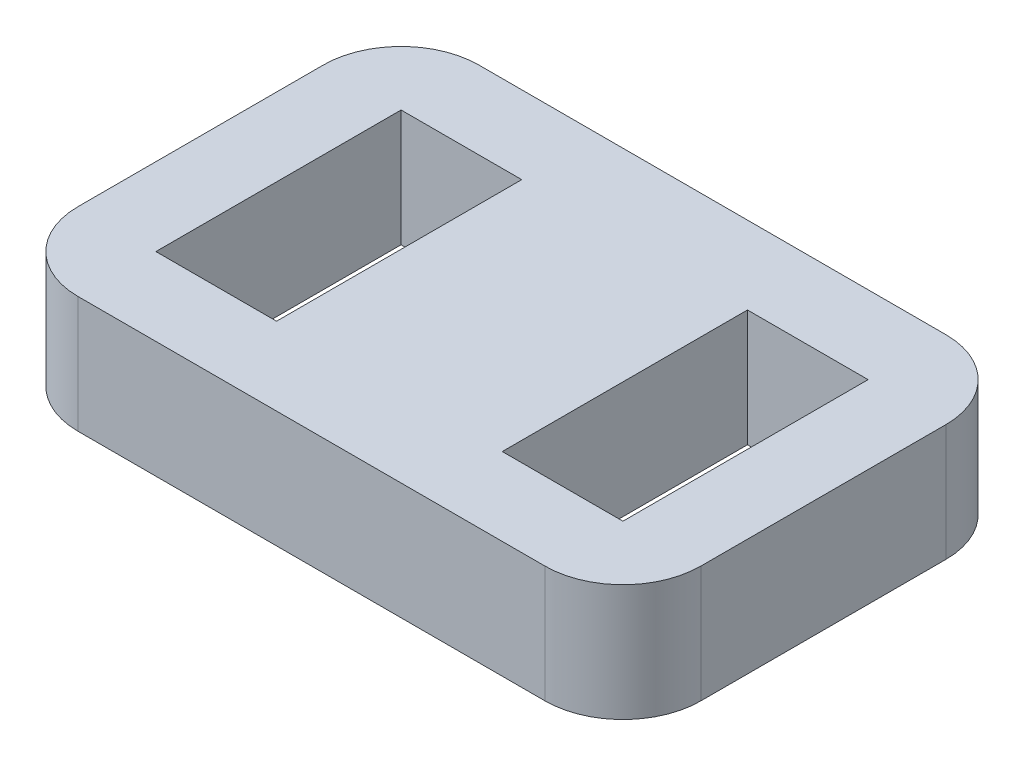
ISO-10303-21;
HEADER;
FILE_DESCRIPTION(('STEP AP214'),'2;1');
FILE_NAME('part.step','',(''),(''),'','','');
FILE_SCHEMA(('AUTOMOTIVE_DESIGN { 1 0 10303 214 1 1 1 1 }'));
ENDSEC;
DATA;
#1=APPLICATION_CONTEXT('core data for automotive mechanical design processes');
#2=APPLICATION_PROTOCOL_DEFINITION('international standard','automotive_design',2000,#1);
#3=PRODUCT_CONTEXT('',#1,'mechanical');
#4=PRODUCT('Part','Part','',(#3));
#5=PRODUCT_RELATED_PRODUCT_CATEGORY('part','',(#4));
#6=PRODUCT_DEFINITION_FORMATION('','',#4);
#7=PRODUCT_DEFINITION_CONTEXT('part definition',#1,'design');
#8=PRODUCT_DEFINITION('design','',#6,#7);
#9=PRODUCT_DEFINITION_SHAPE('','',#8);
#10=(LENGTH_UNIT() NAMED_UNIT(*) SI_UNIT(.MILLI.,.METRE.));
#11=(NAMED_UNIT(*) PLANE_ANGLE_UNIT() SI_UNIT($,.RADIAN.));
#12=(NAMED_UNIT(*) SI_UNIT($,.STERADIAN.) SOLID_ANGLE_UNIT());
#13=UNCERTAINTY_MEASURE_WITH_UNIT(LENGTH_MEASURE(1.E-05),#10,'distance_accuracy_value','');
#14=(GEOMETRIC_REPRESENTATION_CONTEXT(3) GLOBAL_UNCERTAINTY_ASSIGNED_CONTEXT((#13)) GLOBAL_UNIT_ASSIGNED_CONTEXT((#10,
#11,#12)) REPRESENTATION_CONTEXT('',''));
#15=CARTESIAN_POINT('',(0.,0.,0.));
#16=DIRECTION('',(0.,0.,1.));
#17=DIRECTION('',(1.,0.,0.));
#18=AXIS2_PLACEMENT_3D('',#15,#16,#17);
#19=CARTESIAN_POINT('',(6.,3.,3.15000000000001));
#20=DIRECTION('',(0.,1.,0.));
#21=DIRECTION('',(0.,0.,1.));
#22=AXIS2_PLACEMENT_3D('',#19,#20,#21);
#23=PLANE('',#22);
#24=DIRECTION('',(1.,0.,0.));
#25=VECTOR('',#24,1.);
#26=CARTESIAN_POINT('',(-2.9,3.,5.15));
#27=LINE('',#26,#25);
#28=CARTESIAN_POINT('',(-5.99999999999999,3.,5.15000000000001));
#29=VERTEX_POINT('',#28);
#30=CARTESIAN_POINT('',(5.99999999999999,3.,5.15000000000001));
#31=VERTEX_POINT('',#30);
#32=EDGE_CURVE('E244',#29,#31,#27,.T.);
#33=ORIENTED_EDGE('',*,*,#32,.T.);
#34=CARTESIAN_POINT('',(6.,3.,3.15000000000001));
#35=DIRECTION('',(0.,1.,0.));
#36=DIRECTION('',(0.,0.,1.));
#37=AXIS2_PLACEMENT_3D('',#34,#35,#36);
#38=CIRCLE('',#37,2.);
#39=CARTESIAN_POINT('',(8.,3.,3.14999999999999));
#40=VERTEX_POINT('',#39);
#41=EDGE_CURVE('E248',#31,#40,#38,.T.);
#42=ORIENTED_EDGE('',*,*,#41,.T.);
#43=DIRECTION('',(0.,0.,-1.));
#44=VECTOR('',#43,1.);
#45=CARTESIAN_POINT('',(8.,3.,3.14999999999999));
#46=LINE('',#45,#44);
#47=CARTESIAN_POINT('',(8.,3.,-3.14999999999999));
#48=VERTEX_POINT('',#47);
#49=EDGE_CURVE('E252',#40,#48,#46,.T.);
#50=ORIENTED_EDGE('',*,*,#49,.T.);
#51=CARTESIAN_POINT('',(6.,3.,-3.15000000000001));
#52=DIRECTION('',(0.,1.,0.));
#53=DIRECTION('',(0.,0.,-1.));
#54=AXIS2_PLACEMENT_3D('',#51,#52,#53);
#55=CIRCLE('',#54,2.);
#56=CARTESIAN_POINT('',(5.99999999999998,3.,-5.15000000000001));
#57=VERTEX_POINT('',#56);
#58=EDGE_CURVE('E255',#48,#57,#55,.T.);
#59=ORIENTED_EDGE('',*,*,#58,.T.);
#60=DIRECTION('',(-1.,0.,0.));
#61=VECTOR('',#60,1.);
#62=CARTESIAN_POINT('',(-2.9,3.,-5.15));
#63=LINE('',#62,#61);
#64=CARTESIAN_POINT('',(-5.99999999999998,3.,-5.15000000000001));
#65=VERTEX_POINT('',#64);
#66=EDGE_CURVE('E258',#57,#65,#63,.T.);
#67=ORIENTED_EDGE('',*,*,#66,.T.);
#68=CARTESIAN_POINT('',(-6.,3.,-3.15000000000001));
#69=DIRECTION('',(0.,1.,0.));
#70=DIRECTION('',(0.,0.,1.));
#71=AXIS2_PLACEMENT_3D('',#68,#69,#70);
#72=CIRCLE('',#71,2.);
#73=CARTESIAN_POINT('',(-8.,3.,-3.14999999999999));
#74=VERTEX_POINT('',#73);
#75=EDGE_CURVE('E261',#65,#74,#72,.T.);
#76=ORIENTED_EDGE('',*,*,#75,.T.);
#77=DIRECTION('',(0.,0.,1.));
#78=VECTOR('',#77,1.);
#79=CARTESIAN_POINT('',(-8.,3.,-3.14999999999999));
#80=LINE('',#79,#78);
#81=CARTESIAN_POINT('',(-8.,3.,3.14999999999999));
#82=VERTEX_POINT('',#81);
#83=EDGE_CURVE('E264',#74,#82,#80,.T.);
#84=ORIENTED_EDGE('',*,*,#83,.T.);
#85=CARTESIAN_POINT('',(-6.,3.,3.15000000000001));
#86=DIRECTION('',(0.,1.,0.));
#87=DIRECTION('',(0.,0.,1.));
#88=AXIS2_PLACEMENT_3D('',#85,#86,#87);
#89=CIRCLE('',#88,2.);
#90=EDGE_CURVE('E267',#82,#29,#89,.T.);
#91=ORIENTED_EDGE('',*,*,#90,.T.);
#92=EDGE_LOOP('',(#33,#42,#50,#59,#67,#76,#84,#91));
#93=FACE_BOUND('',#92,.T.);
#94=DIRECTION('',(-1.,0.,0.));
#95=VECTOR('',#94,1.);
#96=CARTESIAN_POINT('',(-6.,3.,-3.15));
#97=LINE('',#96,#95);
#98=CARTESIAN_POINT('',(-2.9,3.,-3.15));
#99=VERTEX_POINT('',#98);
#100=CARTESIAN_POINT('',(-6.,3.,-3.15));
#101=VERTEX_POINT('',#100);
#102=EDGE_CURVE('E204',#99,#101,#97,.T.);
#103=ORIENTED_EDGE('',*,*,#102,.F.);
#104=DIRECTION('',(0.,0.,-1.));
#105=VECTOR('',#104,1.);
#106=CARTESIAN_POINT('',(-2.9,3.,-3.15));
#107=LINE('',#106,#105);
#108=CARTESIAN_POINT('',(-2.9,3.,3.15));
#109=VERTEX_POINT('',#108);
#110=EDGE_CURVE('E201',#109,#99,#107,.T.);
#111=ORIENTED_EDGE('',*,*,#110,.F.);
#112=DIRECTION('',(1.,0.,0.));
#113=VECTOR('',#112,1.);
#114=CARTESIAN_POINT('',(-6.,3.,3.15));
#115=LINE('',#114,#113);
#116=CARTESIAN_POINT('',(-6.,3.,3.15));
#117=VERTEX_POINT('',#116);
#118=EDGE_CURVE('E212',#117,#109,#115,.T.);
#119=ORIENTED_EDGE('',*,*,#118,.F.);
#120=DIRECTION('',(0.,0.,1.));
#121=VECTOR('',#120,1.);
#122=CARTESIAN_POINT('',(-6.,3.,-3.15));
#123=LINE('',#122,#121);
#124=EDGE_CURVE('E208',#101,#117,#123,.T.);
#125=ORIENTED_EDGE('',*,*,#124,.F.);
#126=EDGE_LOOP('',(#103,#111,#119,#125));
#127=FACE_BOUND('',#126,.T.);
#128=DIRECTION('',(-1.,0.,0.));
#129=VECTOR('',#128,1.);
#130=CARTESIAN_POINT('',(6.,3.,-3.15));
#131=LINE('',#130,#129);
#132=CARTESIAN_POINT('',(6.,3.,-3.15));
#133=VERTEX_POINT('',#132);
#134=CARTESIAN_POINT('',(2.9,3.,-3.15));
#135=VERTEX_POINT('',#134);
#136=EDGE_CURVE('E162',#133,#135,#131,.T.);
#137=ORIENTED_EDGE('',*,*,#136,.F.);
#138=DIRECTION('',(0.,0.,-1.));
#139=VECTOR('',#138,1.);
#140=CARTESIAN_POINT('',(6.,3.,-3.15));
#141=LINE('',#140,#139);
#142=CARTESIAN_POINT('',(6.,3.,3.15));
#143=VERTEX_POINT('',#142);
#144=EDGE_CURVE('E153',#143,#133,#141,.T.);
#145=ORIENTED_EDGE('',*,*,#144,.F.);
#146=DIRECTION('',(1.,0.,0.));
#147=VECTOR('',#146,1.);
#148=CARTESIAN_POINT('',(6.,3.,3.15));
#149=LINE('',#148,#147);
#150=CARTESIAN_POINT('',(2.9,3.,3.15));
#151=VERTEX_POINT('',#150);
#152=EDGE_CURVE('E179',#151,#143,#149,.T.);
#153=ORIENTED_EDGE('',*,*,#152,.F.);
#154=DIRECTION('',(0.,0.,1.));
#155=VECTOR('',#154,1.);
#156=CARTESIAN_POINT('',(2.9,3.,-3.15));
#157=LINE('',#156,#155);
#158=EDGE_CURVE('E175',#135,#151,#157,.T.);
#159=ORIENTED_EDGE('',*,*,#158,.F.);
#160=EDGE_LOOP('',(#137,#145,#153,#159));
#161=FACE_BOUND('',#160,.T.);
#162=ADVANCED_FACE('F39',(#93,#127,#161),#23,.T.);
#163=CARTESIAN_POINT('',(6.,0.,3.15000000000001));
#164=DIRECTION('',(0.,1.,0.));
#165=DIRECTION('',(0.,0.,1.));
#166=AXIS2_PLACEMENT_3D('',#163,#164,#165);
#167=PLANE('',#166);
#168=DIRECTION('',(0.,0.,-1.));
#169=VECTOR('',#168,1.);
#170=CARTESIAN_POINT('',(-2.9,0.,-3.15));
#171=LINE('',#170,#169);
#172=CARTESIAN_POINT('',(-2.9,0.,3.15));
#173=VERTEX_POINT('',#172);
#174=CARTESIAN_POINT('',(-2.9,0.,-3.15));
#175=VERTEX_POINT('',#174);
#176=EDGE_CURVE('E171',#173,#175,#171,.T.);
#177=ORIENTED_EDGE('',*,*,#176,.T.);
#178=DIRECTION('',(-1.,0.,0.));
#179=VECTOR('',#178,1.);
#180=CARTESIAN_POINT('',(-6.,0.,-3.15));
#181=LINE('',#180,#179);
#182=CARTESIAN_POINT('',(-6.,0.,-3.15));
#183=VERTEX_POINT('',#182);
#184=EDGE_CURVE('E219',#175,#183,#181,.T.);
#185=ORIENTED_EDGE('',*,*,#184,.T.);
#186=DIRECTION('',(0.,0.,1.));
#187=VECTOR('',#186,1.);
#188=CARTESIAN_POINT('',(-6.,0.,-3.15));
#189=LINE('',#188,#187);
#190=CARTESIAN_POINT('',(-6.,0.,3.15));
#191=VERTEX_POINT('',#190);
#192=EDGE_CURVE('E223',#183,#191,#189,.T.);
#193=ORIENTED_EDGE('',*,*,#192,.T.);
#194=DIRECTION('',(1.,0.,0.));
#195=VECTOR('',#194,1.);
#196=CARTESIAN_POINT('',(-6.,0.,3.15));
#197=LINE('',#196,#195);
#198=EDGE_CURVE('E205',#191,#173,#197,.T.);
#199=ORIENTED_EDGE('',*,*,#198,.T.);
#200=EDGE_LOOP('',(#177,#185,#193,#199));
#201=FACE_BOUND('',#200,.T.);
#202=CARTESIAN_POINT('',(6.,0.,3.15000000000001));
#203=DIRECTION('',(0.,1.,0.));
#204=DIRECTION('',(0.,0.,1.));
#205=AXIS2_PLACEMENT_3D('',#202,#203,#204);
#206=CIRCLE('',#205,2.);
#207=CARTESIAN_POINT('',(5.99999999999999,0.,5.15000000000001));
#208=VERTEX_POINT('',#207);
#209=CARTESIAN_POINT('',(8.,0.,3.14999999999999));
#210=VERTEX_POINT('',#209);
#211=EDGE_CURVE('E243',#208,#210,#206,.T.);
#212=ORIENTED_EDGE('',*,*,#211,.F.);
#213=DIRECTION('',(1.,0.,0.));
#214=VECTOR('',#213,1.);
#215=CARTESIAN_POINT('',(-5.99999999999999,0.,5.15000000000001));
#216=LINE('',#215,#214);
#217=CARTESIAN_POINT('',(-5.99999999999999,0.,5.15000000000001));
#218=VERTEX_POINT('',#217);
#219=EDGE_CURVE('E249',#218,#208,#216,.T.);
#220=ORIENTED_EDGE('',*,*,#219,.F.);
#221=CARTESIAN_POINT('',(-6.,0.,3.15000000000001));
#222=DIRECTION('',(0.,1.,0.));
#223=DIRECTION('',(0.,0.,1.));
#224=AXIS2_PLACEMENT_3D('',#221,#222,#223);
#225=CIRCLE('',#224,2.);
#226=CARTESIAN_POINT('',(-8.,0.,3.14999999999999));
#227=VERTEX_POINT('',#226);
#228=EDGE_CURVE('E290',#227,#218,#225,.T.);
#229=ORIENTED_EDGE('',*,*,#228,.F.);
#230=DIRECTION('',(0.,0.,1.));
#231=VECTOR('',#230,1.);
#232=CARTESIAN_POINT('',(-8.,0.,-3.14999999999999));
#233=LINE('',#232,#231);
#234=CARTESIAN_POINT('',(-8.,0.,-3.14999999999999));
#235=VERTEX_POINT('',#234);
#236=EDGE_CURVE('E287',#235,#227,#233,.T.);
#237=ORIENTED_EDGE('',*,*,#236,.F.);
#238=CARTESIAN_POINT('',(-6.,0.,-3.15000000000001));
#239=DIRECTION('',(0.,1.,0.));
#240=DIRECTION('',(0.,0.,1.));
#241=AXIS2_PLACEMENT_3D('',#238,#239,#240);
#242=CIRCLE('',#241,2.);
#243=CARTESIAN_POINT('',(-5.99999999999998,0.,-5.15000000000001));
#244=VERTEX_POINT('',#243);
#245=EDGE_CURVE('E284',#244,#235,#242,.T.);
#246=ORIENTED_EDGE('',*,*,#245,.F.);
#247=DIRECTION('',(-1.,0.,0.));
#248=VECTOR('',#247,1.);
#249=CARTESIAN_POINT('',(-5.99999999999998,0.,-5.15000000000001));
#250=LINE('',#249,#248);
#251=CARTESIAN_POINT('',(5.99999999999998,0.,-5.15000000000001));
#252=VERTEX_POINT('',#251);
#253=EDGE_CURVE('E281',#252,#244,#250,.T.);
#254=ORIENTED_EDGE('',*,*,#253,.F.);
#255=CARTESIAN_POINT('',(6.,0.,-3.15000000000001));
#256=DIRECTION('',(0.,1.,0.));
#257=DIRECTION('',(0.,0.,-1.));
#258=AXIS2_PLACEMENT_3D('',#255,#256,#257);
#259=CIRCLE('',#258,2.);
#260=CARTESIAN_POINT('',(8.,0.,-3.14999999999999));
#261=VERTEX_POINT('',#260);
#262=EDGE_CURVE('E277',#261,#252,#259,.T.);
#263=ORIENTED_EDGE('',*,*,#262,.F.);
#264=DIRECTION('',(0.,0.,-1.));
#265=VECTOR('',#264,1.);
#266=CARTESIAN_POINT('',(8.,0.,3.14999999999999));
#267=LINE('',#266,#265);
#268=EDGE_CURVE('E274',#210,#261,#267,.T.);
#269=ORIENTED_EDGE('',*,*,#268,.F.);
#270=EDGE_LOOP('',(#212,#220,#229,#237,#246,#254,#263,#269));
#271=FACE_BOUND('',#270,.T.);
#272=DIRECTION('',(0.,0.,-1.));
#273=VECTOR('',#272,1.);
#274=CARTESIAN_POINT('',(6.,0.,-3.15));
#275=LINE('',#274,#273);
#276=CARTESIAN_POINT('',(6.,0.,3.15));
#277=VERTEX_POINT('',#276);
#278=CARTESIAN_POINT('',(6.,0.,-3.15));
#279=VERTEX_POINT('',#278);
#280=EDGE_CURVE('E63',#277,#279,#275,.T.);
#281=ORIENTED_EDGE('',*,*,#280,.T.);
#282=DIRECTION('',(-1.,0.,0.));
#283=VECTOR('',#282,1.);
#284=CARTESIAN_POINT('',(6.,0.,-3.15));
#285=LINE('',#284,#283);
#286=CARTESIAN_POINT('',(2.9,0.,-3.15));
#287=VERTEX_POINT('',#286);
#288=EDGE_CURVE('E169',#279,#287,#285,.T.);
#289=ORIENTED_EDGE('',*,*,#288,.T.);
#290=DIRECTION('',(0.,0.,1.));
#291=VECTOR('',#290,1.);
#292=CARTESIAN_POINT('',(2.9,0.,-3.15));
#293=LINE('',#292,#291);
#294=CARTESIAN_POINT('',(2.9,0.,3.15));
#295=VERTEX_POINT('',#294);
#296=EDGE_CURVE('E188',#287,#295,#293,.T.);
#297=ORIENTED_EDGE('',*,*,#296,.T.);
#298=DIRECTION('',(1.,0.,0.));
#299=VECTOR('',#298,1.);
#300=CARTESIAN_POINT('',(6.,0.,3.15));
#301=LINE('',#300,#299);
#302=EDGE_CURVE('E163',#295,#277,#301,.T.);
#303=ORIENTED_EDGE('',*,*,#302,.T.);
#304=EDGE_LOOP('',(#281,#289,#297,#303));
#305=FACE_BOUND('',#304,.T.);
#306=ADVANCED_FACE('F329',(#201,#271,#305),#167,.F.);
#307=CARTESIAN_POINT('',(6.,3.,3.15000000000001));
#308=DIRECTION('',(0.,-1.,0.));
#309=DIRECTION('',(0.,0.,-1.));
#310=AXIS2_PLACEMENT_3D('',#307,#308,#309);
#311=CYLINDRICAL_SURFACE('',#310,2.);
#312=ORIENTED_EDGE('',*,*,#211,.T.);
#313=DIRECTION('',(0.,-1.,0.));
#314=VECTOR('',#313,1.);
#315=CARTESIAN_POINT('',(8.,3.,3.14999999999999));
#316=LINE('',#315,#314);
#317=EDGE_CURVE('E48',#40,#210,#316,.T.);
#318=ORIENTED_EDGE('',*,*,#317,.F.);
#319=ORIENTED_EDGE('',*,*,#41,.F.);
#320=DIRECTION('',(0.,-1.,0.));
#321=VECTOR('',#320,1.);
#322=CARTESIAN_POINT('',(5.99999999999999,3.,5.15000000000001));
#323=LINE('',#322,#321);
#324=EDGE_CURVE('E11',#31,#208,#323,.T.);
#325=ORIENTED_EDGE('',*,*,#324,.T.);
#326=EDGE_LOOP('',(#312,#318,#319,#325));
#327=FACE_BOUND('',#326,.T.);
#328=ADVANCED_FACE('F41',(#327),#311,.T.);
#329=CARTESIAN_POINT('',(8.,3.,3.14999999999999));
#330=DIRECTION('',(-1.,0.,0.));
#331=DIRECTION('',(0.,0.,1.));
#332=AXIS2_PLACEMENT_3D('',#329,#330,#331);
#333=PLANE('',#332);
#334=ORIENTED_EDGE('',*,*,#268,.T.);
#335=DIRECTION('',(0.,-1.,0.));
#336=VECTOR('',#335,1.);
#337=CARTESIAN_POINT('',(8.,3.,-3.14999999999999));
#338=LINE('',#337,#336);
#339=EDGE_CURVE('E314',#48,#261,#338,.T.);
#340=ORIENTED_EDGE('',*,*,#339,.F.);
#341=ORIENTED_EDGE('',*,*,#49,.F.);
#342=ORIENTED_EDGE('',*,*,#317,.T.);
#343=EDGE_LOOP('',(#334,#340,#341,#342));
#344=FACE_BOUND('',#343,.T.);
#345=ADVANCED_FACE('F323',(#344),#333,.F.);
#346=CARTESIAN_POINT('',(6.,3.,-3.15000000000001));
#347=DIRECTION('',(0.,-1.,0.));
#348=DIRECTION('',(0.,0.,-1.));
#349=AXIS2_PLACEMENT_3D('',#346,#347,#348);
#350=CYLINDRICAL_SURFACE('',#349,2.);
#351=ORIENTED_EDGE('',*,*,#262,.T.);
#352=DIRECTION('',(0.,-1.,0.));
#353=VECTOR('',#352,1.);
#354=CARTESIAN_POINT('',(5.99999999999998,3.,-5.15000000000001));
#355=LINE('',#354,#353);
#356=EDGE_CURVE('E310',#57,#252,#355,.T.);
#357=ORIENTED_EDGE('',*,*,#356,.F.);
#358=ORIENTED_EDGE('',*,*,#58,.F.);
#359=ORIENTED_EDGE('',*,*,#339,.T.);
#360=EDGE_LOOP('',(#351,#357,#358,#359));
#361=FACE_BOUND('',#360,.T.);
#362=ADVANCED_FACE('F335',(#361),#350,.T.);
#363=CARTESIAN_POINT('',(-5.99999999999998,3.,-5.15000000000001));
#364=DIRECTION('',(0.,0.,1.));
#365=DIRECTION('',(1.,0.,0.));
#366=AXIS2_PLACEMENT_3D('',#363,#364,#365);
#367=PLANE('',#366);
#368=ORIENTED_EDGE('',*,*,#253,.T.);
#369=DIRECTION('',(0.,-1.,0.));
#370=VECTOR('',#369,1.);
#371=CARTESIAN_POINT('',(-5.99999999999998,3.,-5.15000000000001));
#372=LINE('',#371,#370);
#373=EDGE_CURVE('E306',#65,#244,#372,.T.);
#374=ORIENTED_EDGE('',*,*,#373,.F.);
#375=ORIENTED_EDGE('',*,*,#66,.F.);
#376=ORIENTED_EDGE('',*,*,#356,.T.);
#377=EDGE_LOOP('',(#368,#374,#375,#376));
#378=FACE_BOUND('',#377,.T.);
#379=ADVANCED_FACE('F339',(#378),#367,.F.);
#380=CARTESIAN_POINT('',(-6.,3.,-3.15000000000001));
#381=DIRECTION('',(0.,-1.,0.));
#382=DIRECTION('',(0.,0.,-1.));
#383=AXIS2_PLACEMENT_3D('',#380,#381,#382);
#384=CYLINDRICAL_SURFACE('',#383,2.);
#385=ORIENTED_EDGE('',*,*,#245,.T.);
#386=DIRECTION('',(0.,-1.,0.));
#387=VECTOR('',#386,1.);
#388=CARTESIAN_POINT('',(-8.,3.,-3.14999999999999));
#389=LINE('',#388,#387);
#390=EDGE_CURVE('E302',#74,#235,#389,.T.);
#391=ORIENTED_EDGE('',*,*,#390,.F.);
#392=ORIENTED_EDGE('',*,*,#75,.F.);
#393=ORIENTED_EDGE('',*,*,#373,.T.);
#394=EDGE_LOOP('',(#385,#391,#392,#393));
#395=FACE_BOUND('',#394,.T.);
#396=ADVANCED_FACE('F359',(#395),#384,.T.);
#397=CARTESIAN_POINT('',(-8.,3.,-3.14999999999999));
#398=DIRECTION('',(1.,0.,0.));
#399=DIRECTION('',(0.,0.,-1.));
#400=AXIS2_PLACEMENT_3D('',#397,#398,#399);
#401=PLANE('',#400);
#402=ORIENTED_EDGE('',*,*,#236,.T.);
#403=DIRECTION('',(0.,-1.,0.));
#404=VECTOR('',#403,1.);
#405=CARTESIAN_POINT('',(-8.,3.,3.14999999999999));
#406=LINE('',#405,#404);
#407=EDGE_CURVE('E298',#82,#227,#406,.T.);
#408=ORIENTED_EDGE('',*,*,#407,.F.);
#409=ORIENTED_EDGE('',*,*,#83,.F.);
#410=ORIENTED_EDGE('',*,*,#390,.T.);
#411=EDGE_LOOP('',(#402,#408,#409,#410));
#412=FACE_BOUND('',#411,.T.);
#413=ADVANCED_FACE('F357',(#412),#401,.F.);
#414=CARTESIAN_POINT('',(-6.,3.,3.15000000000001));
#415=DIRECTION('',(0.,-1.,0.));
#416=DIRECTION('',(0.,0.,-1.));
#417=AXIS2_PLACEMENT_3D('',#414,#415,#416);
#418=CYLINDRICAL_SURFACE('',#417,2.);
#419=ORIENTED_EDGE('',*,*,#228,.T.);
#420=DIRECTION('',(0.,-1.,0.));
#421=VECTOR('',#420,1.);
#422=CARTESIAN_POINT('',(-5.99999999999999,3.,5.15000000000001));
#423=LINE('',#422,#421);
#424=EDGE_CURVE('E271',#29,#218,#423,.T.);
#425=ORIENTED_EDGE('',*,*,#424,.F.);
#426=ORIENTED_EDGE('',*,*,#90,.F.);
#427=ORIENTED_EDGE('',*,*,#407,.T.);
#428=EDGE_LOOP('',(#419,#425,#426,#427));
#429=FACE_BOUND('',#428,.T.);
#430=ADVANCED_FACE('F352',(#429),#418,.T.);
#431=CARTESIAN_POINT('',(-5.99999999999999,3.,5.15000000000001));
#432=DIRECTION('',(0.,0.,-1.));
#433=DIRECTION('',(-1.,0.,0.));
#434=AXIS2_PLACEMENT_3D('',#431,#432,#433);
#435=PLANE('',#434);
#436=ORIENTED_EDGE('',*,*,#219,.T.);
#437=ORIENTED_EDGE('',*,*,#324,.F.);
#438=ORIENTED_EDGE('',*,*,#32,.F.);
#439=ORIENTED_EDGE('',*,*,#424,.T.);
#440=EDGE_LOOP('',(#436,#437,#438,#439));
#441=FACE_BOUND('',#440,.T.);
#442=ADVANCED_FACE('F347',(#441),#435,.F.);
#443=CARTESIAN_POINT('',(-2.9,3.,-3.15));
#444=DIRECTION('',(-1.,0.,0.));
#445=DIRECTION('',(0.,0.,1.));
#446=AXIS2_PLACEMENT_3D('',#443,#444,#445);
#447=PLANE('',#446);
#448=ORIENTED_EDGE('',*,*,#176,.F.);
#449=DIRECTION('',(0.,-1.,0.));
#450=VECTOR('',#449,1.);
#451=CARTESIAN_POINT('',(-2.9,3.,3.15));
#452=LINE('',#451,#450);
#453=EDGE_CURVE('E215',#109,#173,#452,.T.);
#454=ORIENTED_EDGE('',*,*,#453,.F.);
#455=ORIENTED_EDGE('',*,*,#110,.T.);
#456=DIRECTION('',(0.,-1.,0.));
#457=VECTOR('',#456,1.);
#458=CARTESIAN_POINT('',(-2.9,3.,-3.15));
#459=LINE('',#458,#457);
#460=EDGE_CURVE('E239',#99,#175,#459,.T.);
#461=ORIENTED_EDGE('',*,*,#460,.T.);
#462=EDGE_LOOP('',(#448,#454,#455,#461));
#463=FACE_BOUND('',#462,.T.);
#464=ADVANCED_FACE('F376',(#463),#447,.T.);
#465=CARTESIAN_POINT('',(-6.,3.,-3.15));
#466=DIRECTION('',(0.,0.,1.));
#467=DIRECTION('',(1.,0.,0.));
#468=AXIS2_PLACEMENT_3D('',#465,#466,#467);
#469=PLANE('',#468);
#470=ORIENTED_EDGE('',*,*,#184,.F.);
#471=ORIENTED_EDGE('',*,*,#460,.F.);
#472=ORIENTED_EDGE('',*,*,#102,.T.);
#473=DIRECTION('',(0.,-1.,0.));
#474=VECTOR('',#473,1.);
#475=CARTESIAN_POINT('',(-6.,3.,-3.15));
#476=LINE('',#475,#474);
#477=EDGE_CURVE('E236',#101,#183,#476,.T.);
#478=ORIENTED_EDGE('',*,*,#477,.T.);
#479=EDGE_LOOP('',(#470,#471,#472,#478));
#480=FACE_BOUND('',#479,.T.);
#481=ADVANCED_FACE('F396',(#480),#469,.T.);
#482=CARTESIAN_POINT('',(-6.,3.,-3.15));
#483=DIRECTION('',(1.,0.,0.));
#484=DIRECTION('',(0.,0.,-1.));
#485=AXIS2_PLACEMENT_3D('',#482,#483,#484);
#486=PLANE('',#485);
#487=ORIENTED_EDGE('',*,*,#192,.F.);
#488=ORIENTED_EDGE('',*,*,#477,.F.);
#489=ORIENTED_EDGE('',*,*,#124,.T.);
#490=DIRECTION('',(0.,-1.,0.));
#491=VECTOR('',#490,1.);
#492=CARTESIAN_POINT('',(-6.,3.,3.15));
#493=LINE('',#492,#491);
#494=EDGE_CURVE('E233',#117,#191,#493,.T.);
#495=ORIENTED_EDGE('',*,*,#494,.T.);
#496=EDGE_LOOP('',(#487,#488,#489,#495));
#497=FACE_BOUND('',#496,.T.);
#498=ADVANCED_FACE('F403',(#497),#486,.T.);
#499=CARTESIAN_POINT('',(-6.,3.,3.15));
#500=DIRECTION('',(0.,0.,-1.));
#501=DIRECTION('',(-1.,0.,0.));
#502=AXIS2_PLACEMENT_3D('',#499,#500,#501);
#503=PLANE('',#502);
#504=ORIENTED_EDGE('',*,*,#198,.F.);
#505=ORIENTED_EDGE('',*,*,#494,.F.);
#506=ORIENTED_EDGE('',*,*,#118,.T.);
#507=ORIENTED_EDGE('',*,*,#453,.T.);
#508=EDGE_LOOP('',(#504,#505,#506,#507));
#509=FACE_BOUND('',#508,.T.);
#510=ADVANCED_FACE('F410',(#509),#503,.T.);
#511=CARTESIAN_POINT('',(6.,3.,-3.15));
#512=DIRECTION('',(-1.,0.,0.));
#513=DIRECTION('',(0.,0.,1.));
#514=AXIS2_PLACEMENT_3D('',#511,#512,#513);
#515=PLANE('',#514);
#516=ORIENTED_EDGE('',*,*,#280,.F.);
#517=DIRECTION('',(0.,-1.,0.));
#518=VECTOR('',#517,1.);
#519=CARTESIAN_POINT('',(6.,3.,3.15));
#520=LINE('',#519,#518);
#521=EDGE_CURVE('E157',#143,#277,#520,.T.);
#522=ORIENTED_EDGE('',*,*,#521,.F.);
#523=ORIENTED_EDGE('',*,*,#144,.T.);
#524=DIRECTION('',(0.,-1.,0.));
#525=VECTOR('',#524,1.);
#526=CARTESIAN_POINT('',(6.,3.,-3.15));
#527=LINE('',#526,#525);
#528=EDGE_CURVE('E156',#133,#279,#527,.T.);
#529=ORIENTED_EDGE('',*,*,#528,.T.);
#530=EDGE_LOOP('',(#516,#522,#523,#529));
#531=FACE_BOUND('',#530,.T.);
#532=ADVANCED_FACE('F155',(#531),#515,.T.);
#533=CARTESIAN_POINT('',(6.,3.,-3.15));
#534=DIRECTION('',(0.,0.,1.));
#535=DIRECTION('',(1.,0.,0.));
#536=AXIS2_PLACEMENT_3D('',#533,#534,#535);
#537=PLANE('',#536);
#538=ORIENTED_EDGE('',*,*,#288,.F.);
#539=ORIENTED_EDGE('',*,*,#528,.F.);
#540=ORIENTED_EDGE('',*,*,#136,.T.);
#541=DIRECTION('',(0.,-1.,0.));
#542=VECTOR('',#541,1.);
#543=CARTESIAN_POINT('',(2.9,3.,-3.15));
#544=LINE('',#543,#542);
#545=EDGE_CURVE('E172',#135,#287,#544,.T.);
#546=ORIENTED_EDGE('',*,*,#545,.T.);
#547=EDGE_LOOP('',(#538,#539,#540,#546));
#548=FACE_BOUND('',#547,.T.);
#549=ADVANCED_FACE('F166',(#548),#537,.T.);
#550=CARTESIAN_POINT('',(2.9,3.,-3.15));
#551=DIRECTION('',(1.,0.,0.));
#552=DIRECTION('',(0.,0.,-1.));
#553=AXIS2_PLACEMENT_3D('',#550,#551,#552);
#554=PLANE('',#553);
#555=ORIENTED_EDGE('',*,*,#296,.F.);
#556=ORIENTED_EDGE('',*,*,#545,.F.);
#557=ORIENTED_EDGE('',*,*,#158,.T.);
#558=DIRECTION('',(0.,-1.,0.));
#559=VECTOR('',#558,1.);
#560=CARTESIAN_POINT('',(2.9,3.,3.15));
#561=LINE('',#560,#559);
#562=EDGE_CURVE('E55',#151,#295,#561,.T.);
#563=ORIENTED_EDGE('',*,*,#562,.T.);
#564=EDGE_LOOP('',(#555,#556,#557,#563));
#565=FACE_BOUND('',#564,.T.);
#566=ADVANCED_FACE('F431',(#565),#554,.T.);
#567=CARTESIAN_POINT('',(6.,3.,3.15));
#568=DIRECTION('',(0.,0.,-1.));
#569=DIRECTION('',(-1.,0.,0.));
#570=AXIS2_PLACEMENT_3D('',#567,#568,#569);
#571=PLANE('',#570);
#572=ORIENTED_EDGE('',*,*,#302,.F.);
#573=ORIENTED_EDGE('',*,*,#562,.F.);
#574=ORIENTED_EDGE('',*,*,#152,.T.);
#575=ORIENTED_EDGE('',*,*,#521,.T.);
#576=EDGE_LOOP('',(#572,#573,#574,#575));
#577=FACE_BOUND('',#576,.T.);
#578=ADVANCED_FACE('F438',(#577),#571,.T.);
#579=CLOSED_SHELL('',(#162,#306,#328,#345,#362,#379,#396,#413,#430,#442,#464,#481,#498,#510,
#532,#549,#566,#578));
#580=MANIFOLD_SOLID_BREP('B2',#579);
#581=ADVANCED_BREP_SHAPE_REPRESENTATION('',(#18,#580),#14);
#582=SHAPE_DEFINITION_REPRESENTATION(#9,#581);
ENDSEC;
END-ISO-10303-21;
